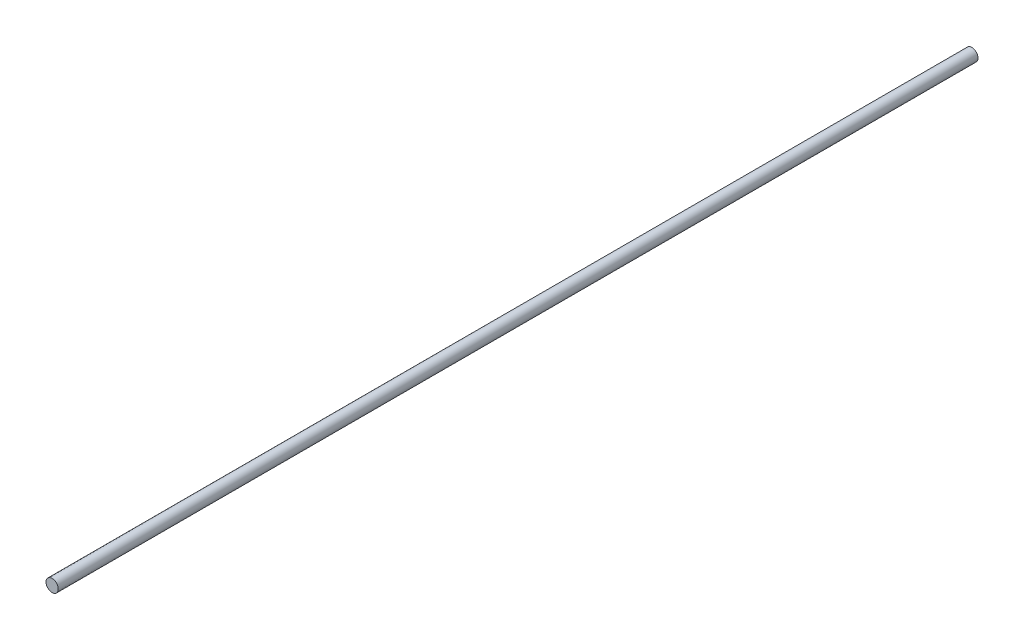
ISO-10303-21;
HEADER;
FILE_DESCRIPTION(('STEP AP214'),'2;1');
FILE_NAME('part.step','',(''),(''),'','','');
FILE_SCHEMA(('AUTOMOTIVE_DESIGN { 1 0 10303 214 1 1 1 1 }'));
ENDSEC;
DATA;
#1=APPLICATION_CONTEXT('core data for automotive mechanical design processes');
#2=APPLICATION_PROTOCOL_DEFINITION('international standard','automotive_design',2000,#1);
#3=PRODUCT_CONTEXT('',#1,'mechanical');
#4=PRODUCT('Part','Part','',(#3));
#5=PRODUCT_RELATED_PRODUCT_CATEGORY('part','',(#4));
#6=PRODUCT_DEFINITION_FORMATION('','',#4);
#7=PRODUCT_DEFINITION_CONTEXT('part definition',#1,'design');
#8=PRODUCT_DEFINITION('design','',#6,#7);
#9=PRODUCT_DEFINITION_SHAPE('','',#8);
#10=(LENGTH_UNIT() NAMED_UNIT(*) SI_UNIT(.MILLI.,.METRE.));
#11=(NAMED_UNIT(*) PLANE_ANGLE_UNIT() SI_UNIT($,.RADIAN.));
#12=(NAMED_UNIT(*) SI_UNIT($,.STERADIAN.) SOLID_ANGLE_UNIT());
#13=UNCERTAINTY_MEASURE_WITH_UNIT(LENGTH_MEASURE(1.E-05),#10,'distance_accuracy_value','');
#14=(GEOMETRIC_REPRESENTATION_CONTEXT(3) GLOBAL_UNCERTAINTY_ASSIGNED_CONTEXT((#13)) GLOBAL_UNIT_ASSIGNED_CONTEXT((#10,
#11,#12)) REPRESENTATION_CONTEXT('',''));
#15=CARTESIAN_POINT('',(0.,0.,0.));
#16=DIRECTION('',(0.,0.,1.));
#17=DIRECTION('',(1.,0.,0.));
#18=AXIS2_PLACEMENT_3D('',#15,#16,#17);
#19=CARTESIAN_POINT('',(0.,0.,300.));
#20=DIRECTION('',(0.,0.,-1.));
#21=DIRECTION('',(-1.,0.,0.));
#22=AXIS2_PLACEMENT_3D('',#19,#20,#21);
#23=CYLINDRICAL_SURFACE('',#22,2.);
#24=CARTESIAN_POINT('',(0.,0.,300.));
#25=DIRECTION('',(0.,0.,1.));
#26=DIRECTION('',(1.,0.,0.));
#27=AXIS2_PLACEMENT_3D('',#24,#25,#26);
#28=CIRCLE('',#27,2.);
#29=CARTESIAN_POINT('',(2.,0.,300.));
#30=VERTEX_POINT('',#29);
#31=EDGE_CURVE('E10',#30,#30,#28,.T.);
#32=ORIENTED_EDGE('',*,*,#31,.F.);
#33=EDGE_LOOP('',(#32));
#34=FACE_BOUND('',#33,.T.);
#35=CARTESIAN_POINT('',(0.,0.,0.));
#36=DIRECTION('',(0.,0.,1.));
#37=DIRECTION('',(1.,0.,0.));
#38=AXIS2_PLACEMENT_3D('',#35,#36,#37);
#39=CIRCLE('',#38,2.);
#40=CARTESIAN_POINT('',(2.,0.,0.));
#41=VERTEX_POINT('',#40);
#42=EDGE_CURVE('E36',#41,#41,#39,.T.);
#43=ORIENTED_EDGE('',*,*,#42,.T.);
#44=EDGE_LOOP('',(#43));
#45=FACE_BOUND('',#44,.T.);
#46=ADVANCED_FACE('F33',(#34,#45),#23,.T.);
#47=CARTESIAN_POINT('',(0.,0.,300.));
#48=DIRECTION('',(0.,0.,1.));
#49=DIRECTION('',(1.,0.,0.));
#50=AXIS2_PLACEMENT_3D('',#47,#48,#49);
#51=PLANE('',#50);
#52=ORIENTED_EDGE('',*,*,#31,.T.);
#53=EDGE_LOOP('',(#52));
#54=FACE_BOUND('',#53,.T.);
#55=ADVANCED_FACE('F48',(#54),#51,.T.);
#56=CARTESIAN_POINT('',(0.,0.,0.));
#57=DIRECTION('',(0.,0.,1.));
#58=DIRECTION('',(1.,0.,0.));
#59=AXIS2_PLACEMENT_3D('',#56,#57,#58);
#60=PLANE('',#59);
#61=ORIENTED_EDGE('',*,*,#42,.F.);
#62=EDGE_LOOP('',(#61));
#63=FACE_BOUND('',#62,.T.);
#64=ADVANCED_FACE('F46',(#63),#60,.F.);
#65=CLOSED_SHELL('',(#46,#55,#64));
#66=MANIFOLD_SOLID_BREP('B2',#65);
#67=ADVANCED_BREP_SHAPE_REPRESENTATION('',(#18,#66),#14);
#68=SHAPE_DEFINITION_REPRESENTATION(#9,#67);
ENDSEC;
END-ISO-10303-21;
